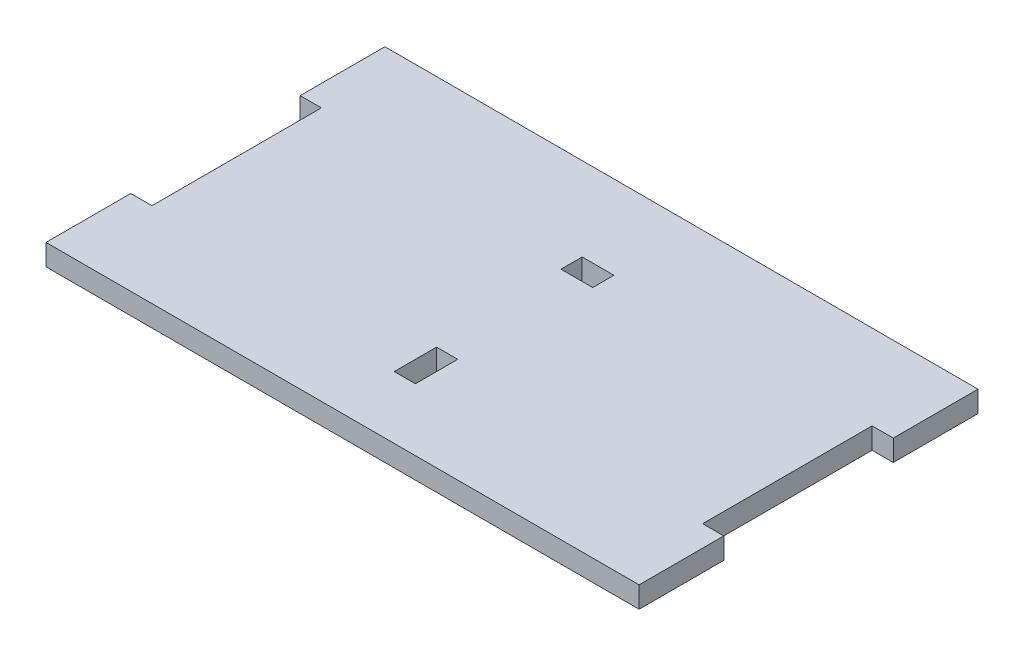
ISO-10303-21;
HEADER;
FILE_DESCRIPTION(('STEP AP214'),'2;1');
FILE_NAME('part.step','',(''),(''),'','','');
FILE_SCHEMA(('AUTOMOTIVE_DESIGN { 1 0 10303 214 1 1 1 1 }'));
ENDSEC;
DATA;
#1=APPLICATION_CONTEXT('core data for automotive mechanical design processes');
#2=APPLICATION_PROTOCOL_DEFINITION('international standard','automotive_design',2000,#1);
#3=PRODUCT_CONTEXT('',#1,'mechanical');
#4=PRODUCT('Part','Part','',(#3));
#5=PRODUCT_RELATED_PRODUCT_CATEGORY('part','',(#4));
#6=PRODUCT_DEFINITION_FORMATION('','',#4);
#7=PRODUCT_DEFINITION_CONTEXT('part definition',#1,'design');
#8=PRODUCT_DEFINITION('design','',#6,#7);
#9=PRODUCT_DEFINITION_SHAPE('','',#8);
#10=(LENGTH_UNIT() NAMED_UNIT(*) SI_UNIT(.MILLI.,.METRE.));
#11=(NAMED_UNIT(*) PLANE_ANGLE_UNIT() SI_UNIT($,.RADIAN.));
#12=(NAMED_UNIT(*) SI_UNIT($,.STERADIAN.) SOLID_ANGLE_UNIT());
#13=UNCERTAINTY_MEASURE_WITH_UNIT(LENGTH_MEASURE(1.E-05),#10,'distance_accuracy_value','');
#14=(GEOMETRIC_REPRESENTATION_CONTEXT(3) GLOBAL_UNCERTAINTY_ASSIGNED_CONTEXT((#13)) GLOBAL_UNIT_ASSIGNED_CONTEXT((#10,
#11,#12)) REPRESENTATION_CONTEXT('',''));
#15=CARTESIAN_POINT('',(0.,0.,0.));
#16=DIRECTION('',(0.,0.,1.));
#17=DIRECTION('',(1.,0.,0.));
#18=AXIS2_PLACEMENT_3D('',#15,#16,#17);
#19=CARTESIAN_POINT('',(0.,3.175,0.));
#20=DIRECTION('',(0.,-1.,0.));
#21=DIRECTION('',(0.,0.,-1.));
#22=AXIS2_PLACEMENT_3D('',#19,#20,#21);
#23=PLANE('',#22);
#24=DIRECTION('',(0.,0.,1.));
#25=VECTOR('',#24,1.);
#26=CARTESIAN_POINT('',(-1.5875,3.175,9.7155));
#27=LINE('',#26,#25);
#28=CARTESIAN_POINT('',(-1.5875,3.175,9.7155));
#29=VERTEX_POINT('',#28);
#30=CARTESIAN_POINT('',(-1.5875,3.175,16.0655));
#31=VERTEX_POINT('',#30);
#32=EDGE_CURVE('E209',#29,#31,#27,.T.);
#33=ORIENTED_EDGE('',*,*,#32,.F.);
#34=DIRECTION('',(-1.,0.,0.));
#35=VECTOR('',#34,1.);
#36=CARTESIAN_POINT('',(-1.5875,3.175,9.7155));
#37=LINE('',#36,#35);
#38=CARTESIAN_POINT('',(1.5875,3.175,9.7155));
#39=VERTEX_POINT('',#38);
#40=EDGE_CURVE('E217',#39,#29,#37,.T.);
#41=ORIENTED_EDGE('',*,*,#40,.F.);
#42=DIRECTION('',(0.,0.,-1.));
#43=VECTOR('',#42,1.);
#44=CARTESIAN_POINT('',(1.5875,3.175,9.7155));
#45=LINE('',#44,#43);
#46=CARTESIAN_POINT('',(1.5875,3.175,16.0655));
#47=VERTEX_POINT('',#46);
#48=EDGE_CURVE('E214',#47,#39,#45,.T.);
#49=ORIENTED_EDGE('',*,*,#48,.F.);
#50=DIRECTION('',(1.,0.,0.));
#51=VECTOR('',#50,1.);
#52=CARTESIAN_POINT('',(-1.5875,3.175,16.0655));
#53=LINE('',#52,#51);
#54=EDGE_CURVE('E211',#31,#47,#53,.T.);
#55=ORIENTED_EDGE('',*,*,#54,.F.);
#56=EDGE_LOOP('',(#33,#41,#49,#55));
#57=FACE_BOUND('',#56,.T.);
#58=DIRECTION('',(0.,0.,-1.));
#59=VECTOR('',#58,1.);
#60=CARTESIAN_POINT('',(44.45,3.175,-25.4));
#61=LINE('',#60,#59);
#62=CARTESIAN_POINT('',(44.45,3.175,-12.7));
#63=VERTEX_POINT('',#62);
#64=CARTESIAN_POINT('',(44.45,3.175,-25.4));
#65=VERTEX_POINT('',#64);
#66=EDGE_CURVE('E240',#63,#65,#61,.T.);
#67=ORIENTED_EDGE('',*,*,#66,.T.);
#68=DIRECTION('',(-1.,0.,0.));
#69=VECTOR('',#68,1.);
#70=CARTESIAN_POINT('',(41.275,3.175,-25.4));
#71=LINE('',#70,#69);
#72=CARTESIAN_POINT('',(-44.45,3.175,-25.4));
#73=VERTEX_POINT('',#72);
#74=EDGE_CURVE('E243',#65,#73,#71,.T.);
#75=ORIENTED_EDGE('',*,*,#74,.T.);
#76=DIRECTION('',(0.,0.,1.));
#77=VECTOR('',#76,1.);
#78=CARTESIAN_POINT('',(-44.45,3.175,-25.4));
#79=LINE('',#78,#77);
#80=CARTESIAN_POINT('',(-44.45,3.175,-12.7));
#81=VERTEX_POINT('',#80);
#82=EDGE_CURVE('E246',#73,#81,#79,.T.);
#83=ORIENTED_EDGE('',*,*,#82,.T.);
#84=DIRECTION('',(1.,0.,0.));
#85=VECTOR('',#84,1.);
#86=CARTESIAN_POINT('',(-44.45,3.175,-12.7));
#87=LINE('',#86,#85);
#88=CARTESIAN_POINT('',(-41.275,3.175,-12.7));
#89=VERTEX_POINT('',#88);
#90=EDGE_CURVE('E248',#81,#89,#87,.T.);
#91=ORIENTED_EDGE('',*,*,#90,.T.);
#92=DIRECTION('',(0.,0.,1.));
#93=VECTOR('',#92,1.);
#94=CARTESIAN_POINT('',(-41.275,3.175,12.7));
#95=LINE('',#94,#93);
#96=CARTESIAN_POINT('',(-41.275,3.175,12.7));
#97=VERTEX_POINT('',#96);
#98=EDGE_CURVE('E250',#89,#97,#95,.T.);
#99=ORIENTED_EDGE('',*,*,#98,.T.);
#100=DIRECTION('',(-1.,0.,0.));
#101=VECTOR('',#100,1.);
#102=CARTESIAN_POINT('',(-44.45,3.175,12.7));
#103=LINE('',#102,#101);
#104=CARTESIAN_POINT('',(-44.45,3.175,12.7));
#105=VERTEX_POINT('',#104);
#106=EDGE_CURVE('E252',#97,#105,#103,.T.);
#107=ORIENTED_EDGE('',*,*,#106,.T.);
#108=DIRECTION('',(0.,0.,1.));
#109=VECTOR('',#108,1.);
#110=CARTESIAN_POINT('',(-44.45,3.175,25.4));
#111=LINE('',#110,#109);
#112=CARTESIAN_POINT('',(-44.45,3.175,25.4));
#113=VERTEX_POINT('',#112);
#114=EDGE_CURVE('E254',#105,#113,#111,.T.);
#115=ORIENTED_EDGE('',*,*,#114,.T.);
#116=DIRECTION('',(1.,0.,0.));
#117=VECTOR('',#116,1.);
#118=CARTESIAN_POINT('',(-41.275,3.175,25.4));
#119=LINE('',#118,#117);
#120=CARTESIAN_POINT('',(44.45,3.175,25.4));
#121=VERTEX_POINT('',#120);
#122=EDGE_CURVE('E256',#113,#121,#119,.T.);
#123=ORIENTED_EDGE('',*,*,#122,.T.);
#124=DIRECTION('',(0.,0.,-1.));
#125=VECTOR('',#124,1.);
#126=CARTESIAN_POINT('',(44.45,3.175,25.4));
#127=LINE('',#126,#125);
#128=CARTESIAN_POINT('',(44.45,3.175,12.7));
#129=VERTEX_POINT('',#128);
#130=EDGE_CURVE('E258',#121,#129,#127,.T.);
#131=ORIENTED_EDGE('',*,*,#130,.T.);
#132=DIRECTION('',(-1.,0.,0.));
#133=VECTOR('',#132,1.);
#134=CARTESIAN_POINT('',(44.45,3.175,12.7));
#135=LINE('',#134,#133);
#136=CARTESIAN_POINT('',(41.275,3.175,12.7));
#137=VERTEX_POINT('',#136);
#138=EDGE_CURVE('E260',#129,#137,#135,.T.);
#139=ORIENTED_EDGE('',*,*,#138,.T.);
#140=DIRECTION('',(0.,0.,-1.));
#141=VECTOR('',#140,1.);
#142=CARTESIAN_POINT('',(41.275,3.175,12.7));
#143=LINE('',#142,#141);
#144=CARTESIAN_POINT('',(41.275,3.175,-12.7));
#145=VERTEX_POINT('',#144);
#146=EDGE_CURVE('E262',#137,#145,#143,.T.);
#147=ORIENTED_EDGE('',*,*,#146,.T.);
#148=DIRECTION('',(1.,0.,0.));
#149=VECTOR('',#148,1.);
#150=CARTESIAN_POINT('',(44.45,3.175,-12.7));
#151=LINE('',#150,#149);
#152=EDGE_CURVE('E264',#145,#63,#151,.T.);
#153=ORIENTED_EDGE('',*,*,#152,.T.);
#154=EDGE_LOOP('',(#67,#75,#83,#91,#99,#107,#115,#123,#131,#139,#147,#153));
#155=FACE_BOUND('',#154,.T.);
#156=DIRECTION('',(0.,0.,1.));
#157=VECTOR('',#156,1.);
#158=CARTESIAN_POINT('',(-2.38125,3.175,-9.7155));
#159=LINE('',#158,#157);
#160=CARTESIAN_POINT('',(-2.38125,3.175,-12.8905));
#161=VERTEX_POINT('',#160);
#162=CARTESIAN_POINT('',(-2.38125,3.175,-9.7155));
#163=VERTEX_POINT('',#162);
#164=EDGE_CURVE('E173',#161,#163,#159,.T.);
#165=ORIENTED_EDGE('',*,*,#164,.F.);
#166=DIRECTION('',(-1.,0.,0.));
#167=VECTOR('',#166,1.);
#168=CARTESIAN_POINT('',(-2.38125,3.175,-12.8905));
#169=LINE('',#168,#167);
#170=CARTESIAN_POINT('',(2.38125,3.175,-12.8905));
#171=VERTEX_POINT('',#170);
#172=EDGE_CURVE('E195',#171,#161,#169,.T.);
#173=ORIENTED_EDGE('',*,*,#172,.F.);
#174=DIRECTION('',(0.,0.,-1.));
#175=VECTOR('',#174,1.);
#176=CARTESIAN_POINT('',(2.38125,3.175,-9.7155));
#177=LINE('',#176,#175);
#178=CARTESIAN_POINT('',(2.38125,3.175,-9.7155));
#179=VERTEX_POINT('',#178);
#180=EDGE_CURVE('E193',#179,#171,#177,.T.);
#181=ORIENTED_EDGE('',*,*,#180,.F.);
#182=DIRECTION('',(1.,0.,0.));
#183=VECTOR('',#182,1.);
#184=CARTESIAN_POINT('',(-2.38125,3.175,-9.7155));
#185=LINE('',#184,#183);
#186=EDGE_CURVE('E181',#163,#179,#185,.T.);
#187=ORIENTED_EDGE('',*,*,#186,.F.);
#188=EDGE_LOOP('',(#165,#173,#181,#187));
#189=FACE_BOUND('',#188,.T.);
#190=ADVANCED_FACE('F36',(#57,#155,#189),#23,.F.);
#191=CARTESIAN_POINT('',(0.,0.,0.));
#192=DIRECTION('',(0.,-1.,0.));
#193=DIRECTION('',(0.,0.,-1.));
#194=AXIS2_PLACEMENT_3D('',#191,#192,#193);
#195=PLANE('',#194);
#196=DIRECTION('',(0.,0.,-1.));
#197=VECTOR('',#196,1.);
#198=CARTESIAN_POINT('',(44.45,0.,-25.4));
#199=LINE('',#198,#197);
#200=CARTESIAN_POINT('',(44.45,0.,-12.7));
#201=VERTEX_POINT('',#200);
#202=CARTESIAN_POINT('',(44.45,0.,-25.4));
#203=VERTEX_POINT('',#202);
#204=EDGE_CURVE('E239',#201,#203,#199,.T.);
#205=ORIENTED_EDGE('',*,*,#204,.F.);
#206=DIRECTION('',(1.,0.,0.));
#207=VECTOR('',#206,1.);
#208=CARTESIAN_POINT('',(44.45,0.,-12.7));
#209=LINE('',#208,#207);
#210=CARTESIAN_POINT('',(41.275,0.,-12.7));
#211=VERTEX_POINT('',#210);
#212=EDGE_CURVE('E244',#211,#201,#209,.T.);
#213=ORIENTED_EDGE('',*,*,#212,.F.);
#214=DIRECTION('',(0.,0.,-1.));
#215=VECTOR('',#214,1.);
#216=CARTESIAN_POINT('',(41.275,0.,12.7));
#217=LINE('',#216,#215);
#218=CARTESIAN_POINT('',(41.275,0.,12.7));
#219=VERTEX_POINT('',#218);
#220=EDGE_CURVE('E288',#219,#211,#217,.T.);
#221=ORIENTED_EDGE('',*,*,#220,.F.);
#222=DIRECTION('',(-1.,0.,0.));
#223=VECTOR('',#222,1.);
#224=CARTESIAN_POINT('',(44.45,0.,12.7));
#225=LINE('',#224,#223);
#226=CARTESIAN_POINT('',(44.45,0.,12.7));
#227=VERTEX_POINT('',#226);
#228=EDGE_CURVE('E286',#227,#219,#225,.T.);
#229=ORIENTED_EDGE('',*,*,#228,.F.);
#230=DIRECTION('',(0.,0.,-1.));
#231=VECTOR('',#230,1.);
#232=CARTESIAN_POINT('',(44.45,0.,25.4));
#233=LINE('',#232,#231);
#234=CARTESIAN_POINT('',(44.45,0.,25.4));
#235=VERTEX_POINT('',#234);
#236=EDGE_CURVE('E284',#235,#227,#233,.T.);
#237=ORIENTED_EDGE('',*,*,#236,.F.);
#238=DIRECTION('',(1.,0.,0.));
#239=VECTOR('',#238,1.);
#240=CARTESIAN_POINT('',(41.275,0.,25.4));
#241=LINE('',#240,#239);
#242=CARTESIAN_POINT('',(-44.45,0.,25.4));
#243=VERTEX_POINT('',#242);
#244=EDGE_CURVE('E282',#243,#235,#241,.T.);
#245=ORIENTED_EDGE('',*,*,#244,.F.);
#246=DIRECTION('',(0.,0.,1.));
#247=VECTOR('',#246,1.);
#248=CARTESIAN_POINT('',(-44.45,0.,25.4));
#249=LINE('',#248,#247);
#250=CARTESIAN_POINT('',(-44.45,0.,12.7));
#251=VERTEX_POINT('',#250);
#252=EDGE_CURVE('E279',#251,#243,#249,.T.);
#253=ORIENTED_EDGE('',*,*,#252,.F.);
#254=DIRECTION('',(-1.,0.,0.));
#255=VECTOR('',#254,1.);
#256=CARTESIAN_POINT('',(-44.45,0.,12.7));
#257=LINE('',#256,#255);
#258=CARTESIAN_POINT('',(-41.275,0.,12.7));
#259=VERTEX_POINT('',#258);
#260=EDGE_CURVE('E277',#259,#251,#257,.T.);
#261=ORIENTED_EDGE('',*,*,#260,.F.);
#262=DIRECTION('',(0.,0.,1.));
#263=VECTOR('',#262,1.);
#264=CARTESIAN_POINT('',(-41.275,0.,12.7));
#265=LINE('',#264,#263);
#266=CARTESIAN_POINT('',(-41.275,0.,-12.7));
#267=VERTEX_POINT('',#266);
#268=EDGE_CURVE('E275',#267,#259,#265,.T.);
#269=ORIENTED_EDGE('',*,*,#268,.F.);
#270=DIRECTION('',(1.,0.,0.));
#271=VECTOR('',#270,1.);
#272=CARTESIAN_POINT('',(-44.45,0.,-12.7));
#273=LINE('',#272,#271);
#274=CARTESIAN_POINT('',(-44.45,0.,-12.7));
#275=VERTEX_POINT('',#274);
#276=EDGE_CURVE('E273',#275,#267,#273,.T.);
#277=ORIENTED_EDGE('',*,*,#276,.F.);
#278=DIRECTION('',(0.,0.,1.));
#279=VECTOR('',#278,1.);
#280=CARTESIAN_POINT('',(-44.45,0.,-25.4));
#281=LINE('',#280,#279);
#282=CARTESIAN_POINT('',(-44.45,0.,-25.4));
#283=VERTEX_POINT('',#282);
#284=EDGE_CURVE('E271',#283,#275,#281,.T.);
#285=ORIENTED_EDGE('',*,*,#284,.F.);
#286=DIRECTION('',(-1.,0.,0.));
#287=VECTOR('',#286,1.);
#288=CARTESIAN_POINT('',(-41.275,0.,-25.4));
#289=LINE('',#288,#287);
#290=EDGE_CURVE('E269',#203,#283,#289,.T.);
#291=ORIENTED_EDGE('',*,*,#290,.F.);
#292=EDGE_LOOP('',(#205,#213,#221,#229,#237,#245,#253,#261,#269,#277,#285,#291));
#293=FACE_BOUND('',#292,.T.);
#294=DIRECTION('',(-1.,0.,0.));
#295=VECTOR('',#294,1.);
#296=CARTESIAN_POINT('',(-1.5875,0.,9.7155));
#297=LINE('',#296,#295);
#298=CARTESIAN_POINT('',(1.5875,0.,9.7155));
#299=VERTEX_POINT('',#298);
#300=CARTESIAN_POINT('',(-1.5875,0.,9.7155));
#301=VERTEX_POINT('',#300);
#302=EDGE_CURVE('E212',#299,#301,#297,.T.);
#303=ORIENTED_EDGE('',*,*,#302,.T.);
#304=DIRECTION('',(0.,0.,1.));
#305=VECTOR('',#304,1.);
#306=CARTESIAN_POINT('',(-1.5875,0.,9.7155));
#307=LINE('',#306,#305);
#308=CARTESIAN_POINT('',(-1.5875,0.,16.0655));
#309=VERTEX_POINT('',#308);
#310=EDGE_CURVE('E189',#301,#309,#307,.T.);
#311=ORIENTED_EDGE('',*,*,#310,.T.);
#312=DIRECTION('',(1.,0.,0.));
#313=VECTOR('',#312,1.);
#314=CARTESIAN_POINT('',(-1.5875,0.,16.0655));
#315=LINE('',#314,#313);
#316=CARTESIAN_POINT('',(1.5875,0.,16.0655));
#317=VERTEX_POINT('',#316);
#318=EDGE_CURVE('E222',#309,#317,#315,.T.);
#319=ORIENTED_EDGE('',*,*,#318,.T.);
#320=DIRECTION('',(0.,0.,-1.));
#321=VECTOR('',#320,1.);
#322=CARTESIAN_POINT('',(1.5875,0.,9.7155));
#323=LINE('',#322,#321);
#324=EDGE_CURVE('E225',#317,#299,#323,.T.);
#325=ORIENTED_EDGE('',*,*,#324,.T.);
#326=EDGE_LOOP('',(#303,#311,#319,#325));
#327=FACE_BOUND('',#326,.T.);
#328=DIRECTION('',(-1.,0.,0.));
#329=VECTOR('',#328,1.);
#330=CARTESIAN_POINT('',(-2.38125,0.,-12.8905));
#331=LINE('',#330,#329);
#332=CARTESIAN_POINT('',(2.38125,0.,-12.8905));
#333=VERTEX_POINT('',#332);
#334=CARTESIAN_POINT('',(-2.38125,0.,-12.8905));
#335=VERTEX_POINT('',#334);
#336=EDGE_CURVE('E182',#333,#335,#331,.T.);
#337=ORIENTED_EDGE('',*,*,#336,.T.);
#338=DIRECTION('',(0.,0.,1.));
#339=VECTOR('',#338,1.);
#340=CARTESIAN_POINT('',(-2.38125,0.,-9.7155));
#341=LINE('',#340,#339);
#342=CARTESIAN_POINT('',(-2.38125,0.,-9.7155));
#343=VERTEX_POINT('',#342);
#344=EDGE_CURVE('E59',#335,#343,#341,.T.);
#345=ORIENTED_EDGE('',*,*,#344,.T.);
#346=DIRECTION('',(1.,0.,0.));
#347=VECTOR('',#346,1.);
#348=CARTESIAN_POINT('',(-2.38125,0.,-9.7155));
#349=LINE('',#348,#347);
#350=CARTESIAN_POINT('',(2.38125,0.,-9.7155));
#351=VERTEX_POINT('',#350);
#352=EDGE_CURVE('E188',#343,#351,#349,.T.);
#353=ORIENTED_EDGE('',*,*,#352,.T.);
#354=DIRECTION('',(0.,0.,-1.));
#355=VECTOR('',#354,1.);
#356=CARTESIAN_POINT('',(2.38125,0.,-9.7155));
#357=LINE('',#356,#355);
#358=EDGE_CURVE('E201',#351,#333,#357,.T.);
#359=ORIENTED_EDGE('',*,*,#358,.T.);
#360=EDGE_LOOP('',(#337,#345,#353,#359));
#361=FACE_BOUND('',#360,.T.);
#362=ADVANCED_FACE('F330',(#293,#327,#361),#195,.T.);
#363=CARTESIAN_POINT('',(44.45,3.175,-25.4));
#364=DIRECTION('',(-1.,0.,0.));
#365=DIRECTION('',(0.,0.,1.));
#366=AXIS2_PLACEMENT_3D('',#363,#364,#365);
#367=PLANE('',#366);
#368=ORIENTED_EDGE('',*,*,#204,.T.);
#369=DIRECTION('',(0.,-1.,0.));
#370=VECTOR('',#369,1.);
#371=CARTESIAN_POINT('',(44.45,3.175,-25.4));
#372=LINE('',#371,#370);
#373=EDGE_CURVE('E11',#65,#203,#372,.T.);
#374=ORIENTED_EDGE('',*,*,#373,.F.);
#375=ORIENTED_EDGE('',*,*,#66,.F.);
#376=DIRECTION('',(0.,-1.,0.));
#377=VECTOR('',#376,1.);
#378=CARTESIAN_POINT('',(44.45,3.175,-12.7));
#379=LINE('',#378,#377);
#380=EDGE_CURVE('E266',#63,#201,#379,.T.);
#381=ORIENTED_EDGE('',*,*,#380,.T.);
#382=EDGE_LOOP('',(#368,#374,#375,#381));
#383=FACE_BOUND('',#382,.T.);
#384=ADVANCED_FACE('F38',(#383),#367,.F.);
#385=CARTESIAN_POINT('',(-41.275,3.175,-25.4));
#386=DIRECTION('',(0.,0.,1.));
#387=DIRECTION('',(1.,0.,0.));
#388=AXIS2_PLACEMENT_3D('',#385,#386,#387);
#389=PLANE('',#388);
#390=ORIENTED_EDGE('',*,*,#290,.T.);
#391=DIRECTION('',(0.,-1.,0.));
#392=VECTOR('',#391,1.);
#393=CARTESIAN_POINT('',(-44.45,3.175,-25.4));
#394=LINE('',#393,#392);
#395=EDGE_CURVE('E44',#73,#283,#394,.T.);
#396=ORIENTED_EDGE('',*,*,#395,.F.);
#397=ORIENTED_EDGE('',*,*,#74,.F.);
#398=ORIENTED_EDGE('',*,*,#373,.T.);
#399=EDGE_LOOP('',(#390,#396,#397,#398));
#400=FACE_BOUND('',#399,.T.);
#401=ADVANCED_FACE('F347',(#400),#389,.F.);
#402=CARTESIAN_POINT('',(-44.45,3.175,-25.4));
#403=DIRECTION('',(1.,0.,0.));
#404=DIRECTION('',(0.,0.,-1.));
#405=AXIS2_PLACEMENT_3D('',#402,#403,#404);
#406=PLANE('',#405);
#407=ORIENTED_EDGE('',*,*,#284,.T.);
#408=DIRECTION('',(0.,-1.,0.));
#409=VECTOR('',#408,1.);
#410=CARTESIAN_POINT('',(-44.45,3.175,-12.7));
#411=LINE('',#410,#409);
#412=EDGE_CURVE('E317',#81,#275,#411,.T.);
#413=ORIENTED_EDGE('',*,*,#412,.F.);
#414=ORIENTED_EDGE('',*,*,#82,.F.);
#415=ORIENTED_EDGE('',*,*,#395,.T.);
#416=EDGE_LOOP('',(#407,#413,#414,#415));
#417=FACE_BOUND('',#416,.T.);
#418=ADVANCED_FACE('F324',(#417),#406,.F.);
#419=CARTESIAN_POINT('',(-44.45,3.175,-12.7));
#420=DIRECTION('',(0.,0.,-1.));
#421=DIRECTION('',(-1.,0.,0.));
#422=AXIS2_PLACEMENT_3D('',#419,#420,#421);
#423=PLANE('',#422);
#424=ORIENTED_EDGE('',*,*,#276,.T.);
#425=DIRECTION('',(0.,-1.,0.));
#426=VECTOR('',#425,1.);
#427=CARTESIAN_POINT('',(-41.275,3.175,-12.7));
#428=LINE('',#427,#426);
#429=EDGE_CURVE('E314',#89,#267,#428,.T.);
#430=ORIENTED_EDGE('',*,*,#429,.F.);
#431=ORIENTED_EDGE('',*,*,#90,.F.);
#432=ORIENTED_EDGE('',*,*,#412,.T.);
#433=EDGE_LOOP('',(#424,#430,#431,#432));
#434=FACE_BOUND('',#433,.T.);
#435=ADVANCED_FACE('F336',(#434),#423,.F.);
#436=CARTESIAN_POINT('',(-41.275,3.175,12.7));
#437=DIRECTION('',(1.,0.,0.));
#438=DIRECTION('',(0.,0.,-1.));
#439=AXIS2_PLACEMENT_3D('',#436,#437,#438);
#440=PLANE('',#439);
#441=ORIENTED_EDGE('',*,*,#268,.T.);
#442=DIRECTION('',(0.,-1.,0.));
#443=VECTOR('',#442,1.);
#444=CARTESIAN_POINT('',(-41.275,3.175,12.7));
#445=LINE('',#444,#443);
#446=EDGE_CURVE('E311',#97,#259,#445,.T.);
#447=ORIENTED_EDGE('',*,*,#446,.F.);
#448=ORIENTED_EDGE('',*,*,#98,.F.);
#449=ORIENTED_EDGE('',*,*,#429,.T.);
#450=EDGE_LOOP('',(#441,#447,#448,#449));
#451=FACE_BOUND('',#450,.T.);
#452=ADVANCED_FACE('F340',(#451),#440,.F.);
#453=CARTESIAN_POINT('',(-44.45,3.175,12.7));
#454=DIRECTION('',(0.,0.,1.));
#455=DIRECTION('',(1.,0.,0.));
#456=AXIS2_PLACEMENT_3D('',#453,#454,#455);
#457=PLANE('',#456);
#458=ORIENTED_EDGE('',*,*,#260,.T.);
#459=DIRECTION('',(0.,-1.,0.));
#460=VECTOR('',#459,1.);
#461=CARTESIAN_POINT('',(-44.45,3.175,12.7));
#462=LINE('',#461,#460);
#463=EDGE_CURVE('E308',#105,#251,#462,.T.);
#464=ORIENTED_EDGE('',*,*,#463,.F.);
#465=ORIENTED_EDGE('',*,*,#106,.F.);
#466=ORIENTED_EDGE('',*,*,#446,.T.);
#467=EDGE_LOOP('',(#458,#464,#465,#466));
#468=FACE_BOUND('',#467,.T.);
#469=ADVANCED_FACE('F379',(#468),#457,.F.);
#470=CARTESIAN_POINT('',(-44.45,3.175,25.4));
#471=DIRECTION('',(1.,0.,0.));
#472=DIRECTION('',(0.,0.,-1.));
#473=AXIS2_PLACEMENT_3D('',#470,#471,#472);
#474=PLANE('',#473);
#475=ORIENTED_EDGE('',*,*,#252,.T.);
#476=DIRECTION('',(0.,-1.,0.));
#477=VECTOR('',#476,1.);
#478=CARTESIAN_POINT('',(-44.45,3.175,25.4));
#479=LINE('',#478,#477);
#480=EDGE_CURVE('E305',#113,#243,#479,.T.);
#481=ORIENTED_EDGE('',*,*,#480,.F.);
#482=ORIENTED_EDGE('',*,*,#114,.F.);
#483=ORIENTED_EDGE('',*,*,#463,.T.);
#484=EDGE_LOOP('',(#475,#481,#482,#483));
#485=FACE_BOUND('',#484,.T.);
#486=ADVANCED_FACE('F377',(#485),#474,.F.);
#487=CARTESIAN_POINT('',(41.275,3.175,25.4));
#488=DIRECTION('',(0.,0.,-1.));
#489=DIRECTION('',(-1.,0.,0.));
#490=AXIS2_PLACEMENT_3D('',#487,#488,#489);
#491=PLANE('',#490);
#492=ORIENTED_EDGE('',*,*,#244,.T.);
#493=DIRECTION('',(0.,-1.,0.));
#494=VECTOR('',#493,1.);
#495=CARTESIAN_POINT('',(44.45,3.175,25.4));
#496=LINE('',#495,#494);
#497=EDGE_CURVE('E302',#121,#235,#496,.T.);
#498=ORIENTED_EDGE('',*,*,#497,.F.);
#499=ORIENTED_EDGE('',*,*,#122,.F.);
#500=ORIENTED_EDGE('',*,*,#480,.T.);
#501=EDGE_LOOP('',(#492,#498,#499,#500));
#502=FACE_BOUND('',#501,.T.);
#503=ADVANCED_FACE('F373',(#502),#491,.F.);
#504=CARTESIAN_POINT('',(44.45,3.175,25.4));
#505=DIRECTION('',(-1.,0.,0.));
#506=DIRECTION('',(0.,0.,1.));
#507=AXIS2_PLACEMENT_3D('',#504,#505,#506);
#508=PLANE('',#507);
#509=ORIENTED_EDGE('',*,*,#236,.T.);
#510=DIRECTION('',(0.,-1.,0.));
#511=VECTOR('',#510,1.);
#512=CARTESIAN_POINT('',(44.45,3.175,12.7));
#513=LINE('',#512,#511);
#514=EDGE_CURVE('E299',#129,#227,#513,.T.);
#515=ORIENTED_EDGE('',*,*,#514,.F.);
#516=ORIENTED_EDGE('',*,*,#130,.F.);
#517=ORIENTED_EDGE('',*,*,#497,.T.);
#518=EDGE_LOOP('',(#509,#515,#516,#517));
#519=FACE_BOUND('',#518,.T.);
#520=ADVANCED_FACE('F368',(#519),#508,.F.);
#521=CARTESIAN_POINT('',(44.45,3.175,12.7));
#522=DIRECTION('',(0.,0.,1.));
#523=DIRECTION('',(1.,0.,0.));
#524=AXIS2_PLACEMENT_3D('',#521,#522,#523);
#525=PLANE('',#524);
#526=ORIENTED_EDGE('',*,*,#228,.T.);
#527=DIRECTION('',(0.,-1.,0.));
#528=VECTOR('',#527,1.);
#529=CARTESIAN_POINT('',(41.275,3.175,12.7));
#530=LINE('',#529,#528);
#531=EDGE_CURVE('E296',#137,#219,#530,.T.);
#532=ORIENTED_EDGE('',*,*,#531,.F.);
#533=ORIENTED_EDGE('',*,*,#138,.F.);
#534=ORIENTED_EDGE('',*,*,#514,.T.);
#535=EDGE_LOOP('',(#526,#532,#533,#534));
#536=FACE_BOUND('',#535,.T.);
#537=ADVANCED_FACE('F363',(#536),#525,.F.);
#538=CARTESIAN_POINT('',(41.275,3.175,12.7));
#539=DIRECTION('',(-1.,0.,0.));
#540=DIRECTION('',(0.,0.,1.));
#541=AXIS2_PLACEMENT_3D('',#538,#539,#540);
#542=PLANE('',#541);
#543=ORIENTED_EDGE('',*,*,#220,.T.);
#544=DIRECTION('',(0.,-1.,0.));
#545=VECTOR('',#544,1.);
#546=CARTESIAN_POINT('',(41.275,3.175,-12.7));
#547=LINE('',#546,#545);
#548=EDGE_CURVE('E293',#145,#211,#547,.T.);
#549=ORIENTED_EDGE('',*,*,#548,.F.);
#550=ORIENTED_EDGE('',*,*,#146,.F.);
#551=ORIENTED_EDGE('',*,*,#531,.T.);
#552=EDGE_LOOP('',(#543,#549,#550,#551));
#553=FACE_BOUND('',#552,.T.);
#554=ADVANCED_FACE('F359',(#553),#542,.F.);
#555=CARTESIAN_POINT('',(44.45,3.175,-12.7));
#556=DIRECTION('',(0.,0.,-1.));
#557=DIRECTION('',(-1.,0.,0.));
#558=AXIS2_PLACEMENT_3D('',#555,#556,#557);
#559=PLANE('',#558);
#560=ORIENTED_EDGE('',*,*,#212,.T.);
#561=ORIENTED_EDGE('',*,*,#380,.F.);
#562=ORIENTED_EDGE('',*,*,#152,.F.);
#563=ORIENTED_EDGE('',*,*,#548,.T.);
#564=EDGE_LOOP('',(#560,#561,#562,#563));
#565=FACE_BOUND('',#564,.T.);
#566=ADVANCED_FACE('F354',(#565),#559,.F.);
#567=CARTESIAN_POINT('',(-1.5875,3.175,9.7155));
#568=DIRECTION('',(1.,0.,0.));
#569=DIRECTION('',(0.,0.,-1.));
#570=AXIS2_PLACEMENT_3D('',#567,#568,#569);
#571=PLANE('',#570);
#572=ORIENTED_EDGE('',*,*,#310,.F.);
#573=DIRECTION('',(0.,-1.,0.));
#574=VECTOR('',#573,1.);
#575=CARTESIAN_POINT('',(-1.5875,3.175,9.7155));
#576=LINE('',#575,#574);
#577=EDGE_CURVE('E219',#29,#301,#576,.T.);
#578=ORIENTED_EDGE('',*,*,#577,.F.);
#579=ORIENTED_EDGE('',*,*,#32,.T.);
#580=DIRECTION('',(0.,-1.,0.));
#581=VECTOR('',#580,1.);
#582=CARTESIAN_POINT('',(-1.5875,3.175,16.0655));
#583=LINE('',#582,#581);
#584=EDGE_CURVE('E236',#31,#309,#583,.T.);
#585=ORIENTED_EDGE('',*,*,#584,.T.);
#586=EDGE_LOOP('',(#572,#578,#579,#585));
#587=FACE_BOUND('',#586,.T.);
#588=ADVANCED_FACE('F397',(#587),#571,.T.);
#589=CARTESIAN_POINT('',(-1.5875,3.175,16.0655));
#590=DIRECTION('',(0.,0.,-1.));
#591=DIRECTION('',(-1.,0.,0.));
#592=AXIS2_PLACEMENT_3D('',#589,#590,#591);
#593=PLANE('',#592);
#594=ORIENTED_EDGE('',*,*,#318,.F.);
#595=ORIENTED_EDGE('',*,*,#584,.F.);
#596=ORIENTED_EDGE('',*,*,#54,.T.);
#597=DIRECTION('',(0.,-1.,0.));
#598=VECTOR('',#597,1.);
#599=CARTESIAN_POINT('',(1.5875,3.175,16.0655));
#600=LINE('',#599,#598);
#601=EDGE_CURVE('E234',#47,#317,#600,.T.);
#602=ORIENTED_EDGE('',*,*,#601,.T.);
#603=EDGE_LOOP('',(#594,#595,#596,#602));
#604=FACE_BOUND('',#603,.T.);
#605=ADVANCED_FACE('F435',(#604),#593,.T.);
#606=CARTESIAN_POINT('',(1.5875,3.175,9.7155));
#607=DIRECTION('',(-1.,0.,0.));
#608=DIRECTION('',(0.,0.,1.));
#609=AXIS2_PLACEMENT_3D('',#606,#607,#608);
#610=PLANE('',#609);
#611=ORIENTED_EDGE('',*,*,#324,.F.);
#612=ORIENTED_EDGE('',*,*,#601,.F.);
#613=ORIENTED_EDGE('',*,*,#48,.T.);
#614=DIRECTION('',(0.,-1.,0.));
#615=VECTOR('',#614,1.);
#616=CARTESIAN_POINT('',(1.5875,3.175,9.7155));
#617=LINE('',#616,#615);
#618=EDGE_CURVE('E232',#39,#299,#617,.T.);
#619=ORIENTED_EDGE('',*,*,#618,.T.);
#620=EDGE_LOOP('',(#611,#612,#613,#619));
#621=FACE_BOUND('',#620,.T.);
#622=ADVANCED_FACE('F442',(#621),#610,.T.);
#623=CARTESIAN_POINT('',(-1.5875,3.175,9.7155));
#624=DIRECTION('',(0.,0.,1.));
#625=DIRECTION('',(1.,0.,0.));
#626=AXIS2_PLACEMENT_3D('',#623,#624,#625);
#627=PLANE('',#626);
#628=ORIENTED_EDGE('',*,*,#302,.F.);
#629=ORIENTED_EDGE('',*,*,#618,.F.);
#630=ORIENTED_EDGE('',*,*,#40,.T.);
#631=ORIENTED_EDGE('',*,*,#577,.T.);
#632=EDGE_LOOP('',(#628,#629,#630,#631));
#633=FACE_BOUND('',#632,.T.);
#634=ADVANCED_FACE('F449',(#633),#627,.T.);
#635=CARTESIAN_POINT('',(-2.38125,3.175,-9.7155));
#636=DIRECTION('',(1.,0.,0.));
#637=DIRECTION('',(0.,0.,-1.));
#638=AXIS2_PLACEMENT_3D('',#635,#636,#637);
#639=PLANE('',#638);
#640=ORIENTED_EDGE('',*,*,#344,.F.);
#641=DIRECTION('',(0.,-1.,0.));
#642=VECTOR('',#641,1.);
#643=CARTESIAN_POINT('',(-2.38125,3.175,-12.8905));
#644=LINE('',#643,#642);
#645=EDGE_CURVE('E177',#161,#335,#644,.T.);
#646=ORIENTED_EDGE('',*,*,#645,.F.);
#647=ORIENTED_EDGE('',*,*,#164,.T.);
#648=DIRECTION('',(0.,-1.,0.));
#649=VECTOR('',#648,1.);
#650=CARTESIAN_POINT('',(-2.38125,3.175,-9.7155));
#651=LINE('',#650,#649);
#652=EDGE_CURVE('E176',#163,#343,#651,.T.);
#653=ORIENTED_EDGE('',*,*,#652,.T.);
#654=EDGE_LOOP('',(#640,#646,#647,#653));
#655=FACE_BOUND('',#654,.T.);
#656=ADVANCED_FACE('F175',(#655),#639,.T.);
#657=CARTESIAN_POINT('',(-2.38125,3.175,-9.7155));
#658=DIRECTION('',(0.,0.,-1.));
#659=DIRECTION('',(-1.,0.,0.));
#660=AXIS2_PLACEMENT_3D('',#657,#658,#659);
#661=PLANE('',#660);
#662=ORIENTED_EDGE('',*,*,#352,.F.);
#663=ORIENTED_EDGE('',*,*,#652,.F.);
#664=ORIENTED_EDGE('',*,*,#186,.T.);
#665=DIRECTION('',(0.,-1.,0.));
#666=VECTOR('',#665,1.);
#667=CARTESIAN_POINT('',(2.38125,3.175,-9.7155));
#668=LINE('',#667,#666);
#669=EDGE_CURVE('E190',#179,#351,#668,.T.);
#670=ORIENTED_EDGE('',*,*,#669,.T.);
#671=EDGE_LOOP('',(#662,#663,#664,#670));
#672=FACE_BOUND('',#671,.T.);
#673=ADVANCED_FACE('F185',(#672),#661,.T.);
#674=CARTESIAN_POINT('',(2.38125,3.175,-9.7155));
#675=DIRECTION('',(-1.,0.,0.));
#676=DIRECTION('',(0.,0.,1.));
#677=AXIS2_PLACEMENT_3D('',#674,#675,#676);
#678=PLANE('',#677);
#679=ORIENTED_EDGE('',*,*,#358,.F.);
#680=ORIENTED_EDGE('',*,*,#669,.F.);
#681=ORIENTED_EDGE('',*,*,#180,.T.);
#682=DIRECTION('',(0.,-1.,0.));
#683=VECTOR('',#682,1.);
#684=CARTESIAN_POINT('',(2.38125,3.175,-12.8905));
#685=LINE('',#684,#683);
#686=EDGE_CURVE('E51',#171,#333,#685,.T.);
#687=ORIENTED_EDGE('',*,*,#686,.T.);
#688=EDGE_LOOP('',(#679,#680,#681,#687));
#689=FACE_BOUND('',#688,.T.);
#690=ADVANCED_FACE('F470',(#689),#678,.T.);
#691=CARTESIAN_POINT('',(-2.38125,3.175,-12.8905));
#692=DIRECTION('',(0.,0.,1.));
#693=DIRECTION('',(1.,0.,0.));
#694=AXIS2_PLACEMENT_3D('',#691,#692,#693);
#695=PLANE('',#694);
#696=ORIENTED_EDGE('',*,*,#336,.F.);
#697=ORIENTED_EDGE('',*,*,#686,.F.);
#698=ORIENTED_EDGE('',*,*,#172,.T.);
#699=ORIENTED_EDGE('',*,*,#645,.T.);
#700=EDGE_LOOP('',(#696,#697,#698,#699));
#701=FACE_BOUND('',#700,.T.);
#702=ADVANCED_FACE('F477',(#701),#695,.T.);
#703=CLOSED_SHELL('',(#190,#362,#384,#401,#418,#435,#452,#469,#486,#503,#520,#537,#554,#566,
#588,#605,#622,#634,#656,#673,#690,#702));
#704=MANIFOLD_SOLID_BREP('B2',#703);
#705=ADVANCED_BREP_SHAPE_REPRESENTATION('',(#18,#704),#14);
#706=SHAPE_DEFINITION_REPRESENTATION(#9,#705);
ENDSEC;
END-ISO-10303-21;
